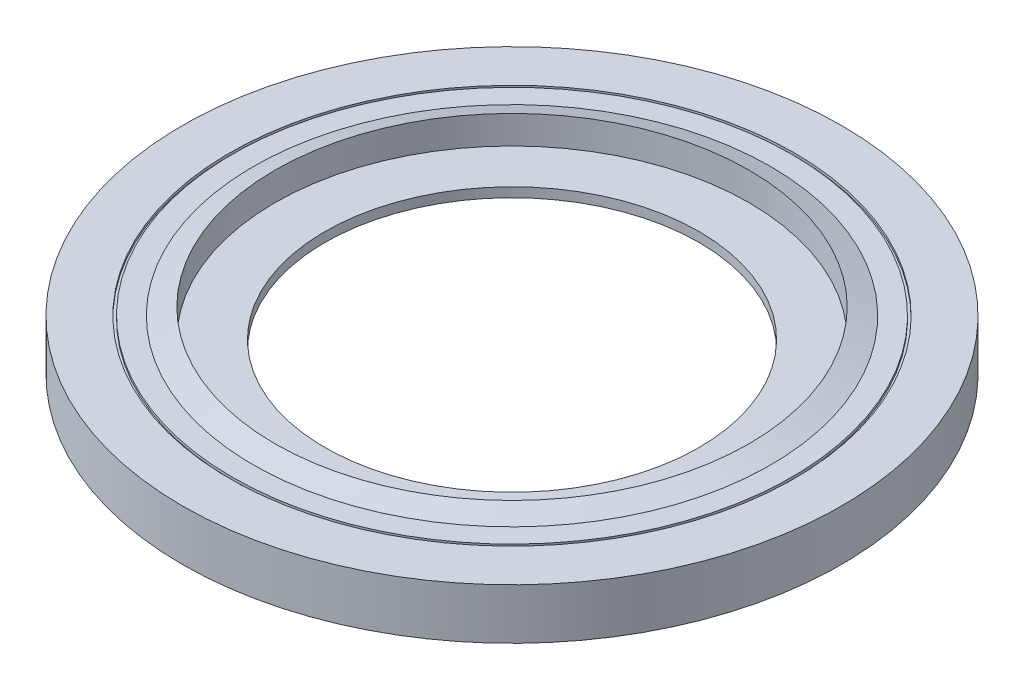
ISO-10303-21;
HEADER;
FILE_DESCRIPTION(('STEP AP214'),'2;1');
FILE_NAME('part.step','',(''),(''),'','','');
FILE_SCHEMA(('AUTOMOTIVE_DESIGN { 1 0 10303 214 1 1 1 1 }'));
ENDSEC;
DATA;
#1=APPLICATION_CONTEXT('core data for automotive mechanical design processes');
#2=APPLICATION_PROTOCOL_DEFINITION('international standard','automotive_design',2000,#1);
#3=PRODUCT_CONTEXT('',#1,'mechanical');
#4=PRODUCT('Part','Part','',(#3));
#5=PRODUCT_RELATED_PRODUCT_CATEGORY('part','',(#4));
#6=PRODUCT_DEFINITION_FORMATION('','',#4);
#7=PRODUCT_DEFINITION_CONTEXT('part definition',#1,'design');
#8=PRODUCT_DEFINITION('design','',#6,#7);
#9=PRODUCT_DEFINITION_SHAPE('','',#8);
#10=(LENGTH_UNIT() NAMED_UNIT(*) SI_UNIT(.MILLI.,.METRE.));
#11=(NAMED_UNIT(*) PLANE_ANGLE_UNIT() SI_UNIT($,.RADIAN.));
#12=(NAMED_UNIT(*) SI_UNIT($,.STERADIAN.) SOLID_ANGLE_UNIT());
#13=UNCERTAINTY_MEASURE_WITH_UNIT(LENGTH_MEASURE(1.E-05),#10,'distance_accuracy_value','');
#14=(GEOMETRIC_REPRESENTATION_CONTEXT(3) GLOBAL_UNCERTAINTY_ASSIGNED_CONTEXT((#13)) GLOBAL_UNIT_ASSIGNED_CONTEXT((#10,
#11,#12)) REPRESENTATION_CONTEXT('',''));
#15=CARTESIAN_POINT('',(0.,0.,0.));
#16=DIRECTION('',(0.,0.,1.));
#17=DIRECTION('',(1.,0.,0.));
#18=AXIS2_PLACEMENT_3D('',#15,#16,#17);
#19=CARTESIAN_POINT('',(7.38,-0.187500000000001,0.));
#20=DIRECTION('',(0.,-1.,0.));
#21=DIRECTION('',(0.,0.,-1.));
#22=AXIS2_PLACEMENT_3D('',#19,#20,#21);
#23=PLANE('',#22);
#24=CARTESIAN_POINT('',(0.,-0.187500000000001,0.));
#25=DIRECTION('',(0.,-1.,0.));
#26=DIRECTION('',(0.,0.,-1.));
#27=AXIS2_PLACEMENT_3D('',#24,#25,#26);
#28=CIRCLE('',#27,9.35);
#29=CARTESIAN_POINT('',(0.,-0.187500000000001,-9.35));
#30=VERTEX_POINT('',#29);
#31=EDGE_CURVE('E10',#30,#30,#28,.T.);
#32=ORIENTED_EDGE('',*,*,#31,.T.);
#33=EDGE_LOOP('',(#32));
#34=FACE_BOUND('',#33,.T.);
#35=CARTESIAN_POINT('',(0.,-0.187500000000001,0.));
#36=DIRECTION('',(0.,-1.,0.));
#37=DIRECTION('',(0.,0.,-1.));
#38=AXIS2_PLACEMENT_3D('',#35,#36,#37);
#39=CIRCLE('',#38,7.38);
#40=CARTESIAN_POINT('',(0.,-0.187500000000001,-7.38));
#41=VERTEX_POINT('',#40);
#42=EDGE_CURVE('E103',#41,#41,#39,.T.);
#43=ORIENTED_EDGE('',*,*,#42,.F.);
#44=EDGE_LOOP('',(#43));
#45=FACE_BOUND('',#44,.T.);
#46=ADVANCED_FACE('F45',(#34,#45),#23,.T.);
#47=CARTESIAN_POINT('',(0.,0.,0.));
#48=DIRECTION('',(0.,-1.,0.));
#49=DIRECTION('',(0.,0.,-1.));
#50=AXIS2_PLACEMENT_3D('',#47,#48,#49);
#51=CYLINDRICAL_SURFACE('',#50,9.35);
#52=CARTESIAN_POINT('',(0.,-1.3,0.));
#53=DIRECTION('',(0.,-1.,0.));
#54=DIRECTION('',(0.,0.,-1.));
#55=AXIS2_PLACEMENT_3D('',#52,#53,#54);
#56=CIRCLE('',#55,9.35);
#57=CARTESIAN_POINT('',(0.,-1.3,-9.35));
#58=VERTEX_POINT('',#57);
#59=EDGE_CURVE('E51',#58,#58,#56,.T.);
#60=ORIENTED_EDGE('',*,*,#59,.T.);
#61=EDGE_LOOP('',(#60));
#62=FACE_BOUND('',#61,.T.);
#63=ORIENTED_EDGE('',*,*,#31,.F.);
#64=EDGE_LOOP('',(#63));
#65=FACE_BOUND('',#64,.T.);
#66=ADVANCED_FACE('F111',(#62,#65),#51,.F.);
#67=CARTESIAN_POINT('',(0.,-1.3,0.));
#68=DIRECTION('',(0.,1.,0.));
#69=DIRECTION('',(0.,0.,1.));
#70=AXIS2_PLACEMENT_3D('',#67,#68,#69);
#71=CONICAL_SURFACE('',#70,9.35,1.23150371234085);
#72=CARTESIAN_POINT('',(0.,-1.,0.));
#73=DIRECTION('',(0.,-1.,0.));
#74=DIRECTION('',(0.,0.,-1.));
#75=AXIS2_PLACEMENT_3D('',#72,#73,#74);
#76=CIRCLE('',#75,10.2);
#77=CARTESIAN_POINT('',(0.,-1.,-10.2));
#78=VERTEX_POINT('',#77);
#79=EDGE_CURVE('E55',#78,#78,#76,.T.);
#80=ORIENTED_EDGE('',*,*,#79,.T.);
#81=EDGE_LOOP('',(#80));
#82=FACE_BOUND('',#81,.T.);
#83=ORIENTED_EDGE('',*,*,#59,.F.);
#84=EDGE_LOOP('',(#83));
#85=FACE_BOUND('',#84,.T.);
#86=ADVANCED_FACE('F115',(#82,#85),#71,.T.);
#87=CARTESIAN_POINT('',(10.2,-1.,0.));
#88=DIRECTION('',(0.,-1.,0.));
#89=DIRECTION('',(0.,0.,-1.));
#90=AXIS2_PLACEMENT_3D('',#87,#88,#89);
#91=PLANE('',#90);
#92=CARTESIAN_POINT('',(0.,-1.,0.));
#93=DIRECTION('',(0.,-1.,0.));
#94=DIRECTION('',(0.,0.,-1.));
#95=AXIS2_PLACEMENT_3D('',#92,#93,#94);
#96=CIRCLE('',#95,11.0333333333333);
#97=CARTESIAN_POINT('',(0.,-1.,-11.0333333333333));
#98=VERTEX_POINT('',#97);
#99=EDGE_CURVE('E59',#98,#98,#96,.T.);
#100=ORIENTED_EDGE('',*,*,#99,.T.);
#101=EDGE_LOOP('',(#100));
#102=FACE_BOUND('',#101,.T.);
#103=ORIENTED_EDGE('',*,*,#79,.F.);
#104=EDGE_LOOP('',(#103));
#105=FACE_BOUND('',#104,.T.);
#106=ADVANCED_FACE('F119',(#102,#105),#91,.T.);
#107=CARTESIAN_POINT('',(0.,0.,0.));
#108=DIRECTION('',(0.,-1.,0.));
#109=DIRECTION('',(0.,0.,-1.));
#110=AXIS2_PLACEMENT_3D('',#107,#108,#109);
#111=CYLINDRICAL_SURFACE('',#110,11.0333333333333);
#112=CARTESIAN_POINT('',(0.,-0.9,0.));
#113=DIRECTION('',(0.,-1.,0.));
#114=DIRECTION('',(0.,0.,-1.));
#115=AXIS2_PLACEMENT_3D('',#112,#113,#114);
#116=CIRCLE('',#115,11.0333333333333);
#117=CARTESIAN_POINT('',(0.,-0.9,-11.0333333333333));
#118=VERTEX_POINT('',#117);
#119=EDGE_CURVE('E64',#118,#118,#116,.T.);
#120=ORIENTED_EDGE('',*,*,#119,.T.);
#121=EDGE_LOOP('',(#120));
#122=FACE_BOUND('',#121,.T.);
#123=ORIENTED_EDGE('',*,*,#99,.F.);
#124=EDGE_LOOP('',(#123));
#125=FACE_BOUND('',#124,.T.);
#126=ADVANCED_FACE('F126',(#122,#125),#111,.T.);
#127=CARTESIAN_POINT('',(11.1333333333333,-0.9,0.));
#128=DIRECTION('',(0.,-1.,0.));
#129=DIRECTION('',(0.,0.,-1.));
#130=AXIS2_PLACEMENT_3D('',#127,#128,#129);
#131=PLANE('',#130);
#132=CARTESIAN_POINT('',(0.,-0.9,0.));
#133=DIRECTION('',(0.,-1.,0.));
#134=DIRECTION('',(0.,0.,-1.));
#135=AXIS2_PLACEMENT_3D('',#132,#133,#134);
#136=CIRCLE('',#135,11.1333333333333);
#137=CARTESIAN_POINT('',(0.,-0.9,-11.1333333333333));
#138=VERTEX_POINT('',#137);
#139=EDGE_CURVE('E67',#138,#138,#136,.T.);
#140=ORIENTED_EDGE('',*,*,#139,.T.);
#141=EDGE_LOOP('',(#140));
#142=FACE_BOUND('',#141,.T.);
#143=ORIENTED_EDGE('',*,*,#119,.F.);
#144=EDGE_LOOP('',(#143));
#145=FACE_BOUND('',#144,.T.);
#146=ADVANCED_FACE('F130',(#142,#145),#131,.T.);
#147=CARTESIAN_POINT('',(0.,0.,0.));
#148=DIRECTION('',(0.,-1.,0.));
#149=DIRECTION('',(0.,0.,-1.));
#150=AXIS2_PLACEMENT_3D('',#147,#148,#149);
#151=CYLINDRICAL_SURFACE('',#150,11.1333333333333);
#152=CARTESIAN_POINT('',(0.,-1.,0.));
#153=DIRECTION('',(0.,-1.,0.));
#154=DIRECTION('',(0.,0.,-1.));
#155=AXIS2_PLACEMENT_3D('',#152,#153,#154);
#156=CIRCLE('',#155,11.1333333333333);
#157=CARTESIAN_POINT('',(0.,-1.,-11.1333333333333));
#158=VERTEX_POINT('',#157);
#159=EDGE_CURVE('E70',#158,#158,#156,.T.);
#160=ORIENTED_EDGE('',*,*,#159,.T.);
#161=EDGE_LOOP('',(#160));
#162=FACE_BOUND('',#161,.T.);
#163=ORIENTED_EDGE('',*,*,#139,.F.);
#164=EDGE_LOOP('',(#163));
#165=FACE_BOUND('',#164,.T.);
#166=ADVANCED_FACE('F134',(#162,#165),#151,.F.);
#167=CARTESIAN_POINT('',(11.1333333333333,-1.,0.));
#168=DIRECTION('',(0.,-1.,0.));
#169=DIRECTION('',(0.,0.,-1.));
#170=AXIS2_PLACEMENT_3D('',#167,#168,#169);
#171=PLANE('',#170);
#172=CARTESIAN_POINT('',(0.,-1.,0.));
#173=DIRECTION('',(0.,-1.,0.));
#174=DIRECTION('',(0.,0.,-1.));
#175=AXIS2_PLACEMENT_3D('',#172,#173,#174);
#176=CIRCLE('',#175,13.);
#177=CARTESIAN_POINT('',(0.,-1.,-13.));
#178=VERTEX_POINT('',#177);
#179=EDGE_CURVE('E73',#178,#178,#176,.T.);
#180=ORIENTED_EDGE('',*,*,#179,.T.);
#181=EDGE_LOOP('',(#180));
#182=FACE_BOUND('',#181,.T.);
#183=ORIENTED_EDGE('',*,*,#159,.F.);
#184=EDGE_LOOP('',(#183));
#185=FACE_BOUND('',#184,.T.);
#186=ADVANCED_FACE('F138',(#182,#185),#171,.T.);
#187=CARTESIAN_POINT('',(0.,0.,0.));
#188=DIRECTION('',(0.,-1.,0.));
#189=DIRECTION('',(0.,0.,-1.));
#190=AXIS2_PLACEMENT_3D('',#187,#188,#189);
#191=CYLINDRICAL_SURFACE('',#190,13.);
#192=CARTESIAN_POINT('',(0.,1.,0.));
#193=DIRECTION('',(0.,-1.,0.));
#194=DIRECTION('',(0.,0.,-1.));
#195=AXIS2_PLACEMENT_3D('',#192,#193,#194);
#196=CIRCLE('',#195,13.);
#197=CARTESIAN_POINT('',(0.,1.,-13.));
#198=VERTEX_POINT('',#197);
#199=EDGE_CURVE('E76',#198,#198,#196,.T.);
#200=ORIENTED_EDGE('',*,*,#199,.T.);
#201=EDGE_LOOP('',(#200));
#202=FACE_BOUND('',#201,.T.);
#203=ORIENTED_EDGE('',*,*,#179,.F.);
#204=EDGE_LOOP('',(#203));
#205=FACE_BOUND('',#204,.T.);
#206=ADVANCED_FACE('F142',(#202,#205),#191,.T.);
#207=CARTESIAN_POINT('',(13.,0.999999999999999,0.));
#208=DIRECTION('',(0.,1.,0.));
#209=DIRECTION('',(0.,0.,1.));
#210=AXIS2_PLACEMENT_3D('',#207,#208,#209);
#211=PLANE('',#210);
#212=CARTESIAN_POINT('',(0.,0.999999999999999,0.));
#213=DIRECTION('',(0.,-1.,0.));
#214=DIRECTION('',(0.,0.,-1.));
#215=AXIS2_PLACEMENT_3D('',#212,#213,#214);
#216=CIRCLE('',#215,11.1333333333333);
#217=CARTESIAN_POINT('',(0.,0.999999999999999,-11.1333333333333));
#218=VERTEX_POINT('',#217);
#219=EDGE_CURVE('E79',#218,#218,#216,.T.);
#220=ORIENTED_EDGE('',*,*,#219,.T.);
#221=EDGE_LOOP('',(#220));
#222=FACE_BOUND('',#221,.T.);
#223=ORIENTED_EDGE('',*,*,#199,.F.);
#224=EDGE_LOOP('',(#223));
#225=FACE_BOUND('',#224,.T.);
#226=ADVANCED_FACE('F146',(#222,#225),#211,.T.);
#227=CARTESIAN_POINT('',(0.,0.,0.));
#228=DIRECTION('',(0.,-1.,0.));
#229=DIRECTION('',(0.,0.,-1.));
#230=AXIS2_PLACEMENT_3D('',#227,#228,#229);
#231=CYLINDRICAL_SURFACE('',#230,11.1333333333333);
#232=CARTESIAN_POINT('',(0.,0.899999999999999,0.));
#233=DIRECTION('',(0.,-1.,0.));
#234=DIRECTION('',(0.,0.,-1.));
#235=AXIS2_PLACEMENT_3D('',#232,#233,#234);
#236=CIRCLE('',#235,11.1333333333333);
#237=CARTESIAN_POINT('',(0.,0.899999999999999,-11.1333333333333));
#238=VERTEX_POINT('',#237);
#239=EDGE_CURVE('E82',#238,#238,#236,.T.);
#240=ORIENTED_EDGE('',*,*,#239,.T.);
#241=EDGE_LOOP('',(#240));
#242=FACE_BOUND('',#241,.T.);
#243=ORIENTED_EDGE('',*,*,#219,.F.);
#244=EDGE_LOOP('',(#243));
#245=FACE_BOUND('',#244,.T.);
#246=ADVANCED_FACE('F150',(#242,#245),#231,.F.);
#247=CARTESIAN_POINT('',(11.1333333333333,0.899999999999999,0.));
#248=DIRECTION('',(0.,1.,0.));
#249=DIRECTION('',(0.,0.,1.));
#250=AXIS2_PLACEMENT_3D('',#247,#248,#249);
#251=PLANE('',#250);
#252=CARTESIAN_POINT('',(0.,0.899999999999999,0.));
#253=DIRECTION('',(0.,-1.,0.));
#254=DIRECTION('',(0.,0.,-1.));
#255=AXIS2_PLACEMENT_3D('',#252,#253,#254);
#256=CIRCLE('',#255,11.0333333333333);
#257=CARTESIAN_POINT('',(0.,0.899999999999999,-11.0333333333333));
#258=VERTEX_POINT('',#257);
#259=EDGE_CURVE('E85',#258,#258,#256,.T.);
#260=ORIENTED_EDGE('',*,*,#259,.T.);
#261=EDGE_LOOP('',(#260));
#262=FACE_BOUND('',#261,.T.);
#263=ORIENTED_EDGE('',*,*,#239,.F.);
#264=EDGE_LOOP('',(#263));
#265=FACE_BOUND('',#264,.T.);
#266=ADVANCED_FACE('F154',(#262,#265),#251,.T.);
#267=CARTESIAN_POINT('',(0.,0.,0.));
#268=DIRECTION('',(0.,-1.,0.));
#269=DIRECTION('',(0.,0.,-1.));
#270=AXIS2_PLACEMENT_3D('',#267,#268,#269);
#271=CYLINDRICAL_SURFACE('',#270,11.0333333333333);
#272=CARTESIAN_POINT('',(0.,0.999999999999999,0.));
#273=DIRECTION('',(0.,-1.,0.));
#274=DIRECTION('',(0.,0.,-1.));
#275=AXIS2_PLACEMENT_3D('',#272,#273,#274);
#276=CIRCLE('',#275,11.0333333333333);
#277=CARTESIAN_POINT('',(0.,0.999999999999999,-11.0333333333333));
#278=VERTEX_POINT('',#277);
#279=EDGE_CURVE('E88',#278,#278,#276,.T.);
#280=ORIENTED_EDGE('',*,*,#279,.T.);
#281=EDGE_LOOP('',(#280));
#282=FACE_BOUND('',#281,.T.);
#283=ORIENTED_EDGE('',*,*,#259,.F.);
#284=EDGE_LOOP('',(#283));
#285=FACE_BOUND('',#284,.T.);
#286=ADVANCED_FACE('F158',(#282,#285),#271,.T.);
#287=CARTESIAN_POINT('',(10.2,0.999999999999999,0.));
#288=DIRECTION('',(0.,1.,0.));
#289=DIRECTION('',(0.,0.,1.));
#290=AXIS2_PLACEMENT_3D('',#287,#288,#289);
#291=PLANE('',#290);
#292=CARTESIAN_POINT('',(0.,0.999999999999999,0.));
#293=DIRECTION('',(0.,-1.,0.));
#294=DIRECTION('',(0.,0.,-1.));
#295=AXIS2_PLACEMENT_3D('',#292,#293,#294);
#296=CIRCLE('',#295,10.2);
#297=CARTESIAN_POINT('',(0.,0.999999999999999,-10.2));
#298=VERTEX_POINT('',#297);
#299=EDGE_CURVE('E91',#298,#298,#296,.T.);
#300=ORIENTED_EDGE('',*,*,#299,.T.);
#301=EDGE_LOOP('',(#300));
#302=FACE_BOUND('',#301,.T.);
#303=ORIENTED_EDGE('',*,*,#279,.F.);
#304=EDGE_LOOP('',(#303));
#305=FACE_BOUND('',#304,.T.);
#306=ADVANCED_FACE('F162',(#302,#305),#291,.T.);
#307=CARTESIAN_POINT('',(0.,0.999999999999999,0.));
#308=DIRECTION('',(0.,-1.,0.));
#309=DIRECTION('',(0.,0.,-1.));
#310=AXIS2_PLACEMENT_3D('',#307,#308,#309);
#311=CONICAL_SURFACE('',#310,10.2,1.23150371234085);
#312=CARTESIAN_POINT('',(0.,1.3,0.));
#313=DIRECTION('',(0.,-1.,0.));
#314=DIRECTION('',(0.,0.,-1.));
#315=AXIS2_PLACEMENT_3D('',#312,#313,#314);
#316=CIRCLE('',#315,9.35);
#317=CARTESIAN_POINT('',(0.,1.3,-9.35));
#318=VERTEX_POINT('',#317);
#319=EDGE_CURVE('E94',#318,#318,#316,.T.);
#320=ORIENTED_EDGE('',*,*,#319,.T.);
#321=EDGE_LOOP('',(#320));
#322=FACE_BOUND('',#321,.T.);
#323=ORIENTED_EDGE('',*,*,#299,.F.);
#324=EDGE_LOOP('',(#323));
#325=FACE_BOUND('',#324,.T.);
#326=ADVANCED_FACE('F166',(#322,#325),#311,.T.);
#327=CARTESIAN_POINT('',(0.,0.,0.));
#328=DIRECTION('',(0.,-1.,0.));
#329=DIRECTION('',(0.,0.,-1.));
#330=AXIS2_PLACEMENT_3D('',#327,#328,#329);
#331=CYLINDRICAL_SURFACE('',#330,9.35);
#332=CARTESIAN_POINT('',(0.,0.187499999999999,0.));
#333=DIRECTION('',(0.,-1.,0.));
#334=DIRECTION('',(0.,0.,-1.));
#335=AXIS2_PLACEMENT_3D('',#332,#333,#334);
#336=CIRCLE('',#335,9.35);
#337=CARTESIAN_POINT('',(0.,0.187499999999999,-9.35));
#338=VERTEX_POINT('',#337);
#339=EDGE_CURVE('E97',#338,#338,#336,.T.);
#340=ORIENTED_EDGE('',*,*,#339,.T.);
#341=EDGE_LOOP('',(#340));
#342=FACE_BOUND('',#341,.T.);
#343=ORIENTED_EDGE('',*,*,#319,.F.);
#344=EDGE_LOOP('',(#343));
#345=FACE_BOUND('',#344,.T.);
#346=ADVANCED_FACE('F170',(#342,#345),#331,.F.);
#347=CARTESIAN_POINT('',(7.38,0.187499999999999,0.));
#348=DIRECTION('',(0.,1.,0.));
#349=DIRECTION('',(0.,0.,1.));
#350=AXIS2_PLACEMENT_3D('',#347,#348,#349);
#351=PLANE('',#350);
#352=CARTESIAN_POINT('',(0.,0.187499999999999,0.));
#353=DIRECTION('',(0.,-1.,0.));
#354=DIRECTION('',(0.,0.,-1.));
#355=AXIS2_PLACEMENT_3D('',#352,#353,#354);
#356=CIRCLE('',#355,7.38);
#357=CARTESIAN_POINT('',(0.,0.187499999999999,-7.38));
#358=VERTEX_POINT('',#357);
#359=EDGE_CURVE('E100',#358,#358,#356,.T.);
#360=ORIENTED_EDGE('',*,*,#359,.T.);
#361=EDGE_LOOP('',(#360));
#362=FACE_BOUND('',#361,.T.);
#363=ORIENTED_EDGE('',*,*,#339,.F.);
#364=EDGE_LOOP('',(#363));
#365=FACE_BOUND('',#364,.T.);
#366=ADVANCED_FACE('F174',(#362,#365),#351,.T.);
#367=CARTESIAN_POINT('',(0.,0.,0.));
#368=DIRECTION('',(0.,-1.,0.));
#369=DIRECTION('',(0.,0.,-1.));
#370=AXIS2_PLACEMENT_3D('',#367,#368,#369);
#371=CYLINDRICAL_SURFACE('',#370,7.38);
#372=ORIENTED_EDGE('',*,*,#42,.T.);
#373=EDGE_LOOP('',(#372));
#374=FACE_BOUND('',#373,.T.);
#375=ORIENTED_EDGE('',*,*,#359,.F.);
#376=EDGE_LOOP('',(#375));
#377=FACE_BOUND('',#376,.T.);
#378=ADVANCED_FACE('F107',(#374,#377),#371,.F.);
#379=CLOSED_SHELL('',(#46,#66,#86,#106,#126,#146,#166,#186,#206,#226,#246,#266,#286,#306,#326,
#346,#366,#378));
#380=MANIFOLD_SOLID_BREP('B2',#379);
#381=ADVANCED_BREP_SHAPE_REPRESENTATION('',(#18,#380),#14);
#382=SHAPE_DEFINITION_REPRESENTATION(#9,#381);
ENDSEC;
END-ISO-10303-21;
